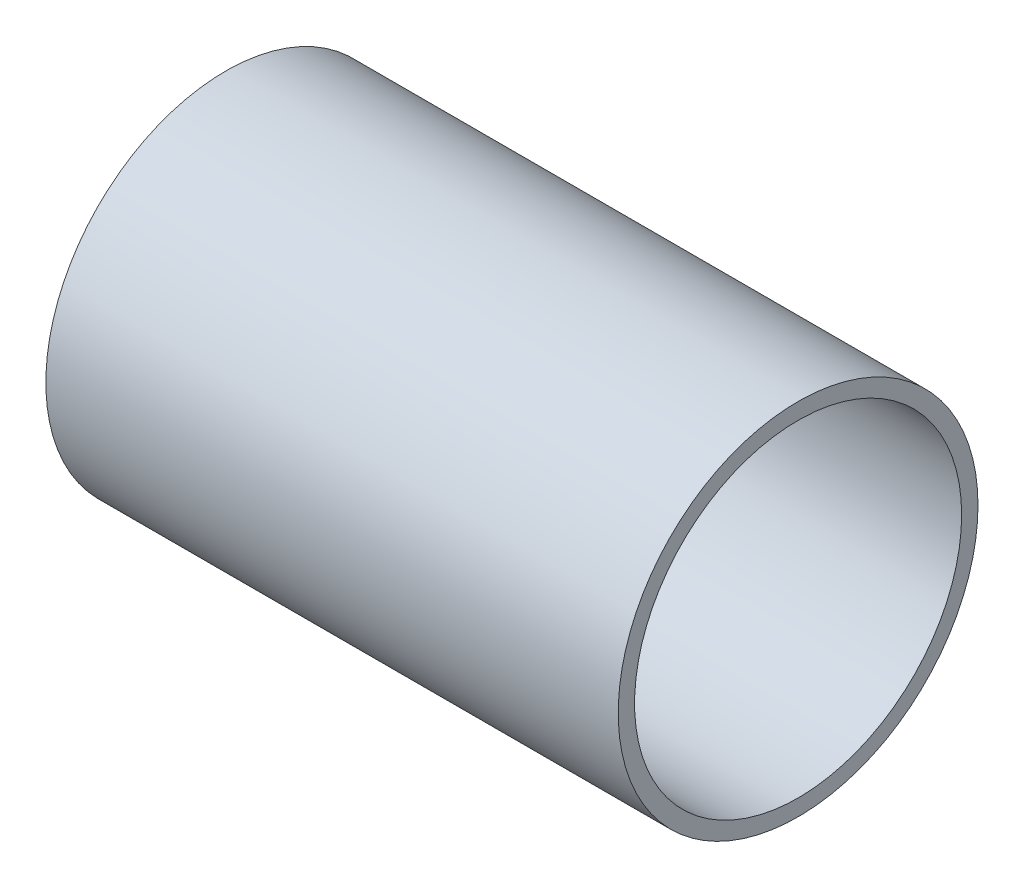
ISO-10303-21;
HEADER;
FILE_DESCRIPTION(('STEP AP214'),'2;1');
FILE_NAME('part.step','',(''),(''),'','','');
FILE_SCHEMA(('AUTOMOTIVE_DESIGN { 1 0 10303 214 1 1 1 1 }'));
ENDSEC;
DATA;
#1=APPLICATION_CONTEXT('core data for automotive mechanical design processes');
#2=APPLICATION_PROTOCOL_DEFINITION('international standard','automotive_design',2000,#1);
#3=PRODUCT_CONTEXT('',#1,'mechanical');
#4=PRODUCT('Part','Part','',(#3));
#5=PRODUCT_RELATED_PRODUCT_CATEGORY('part','',(#4));
#6=PRODUCT_DEFINITION_FORMATION('','',#4);
#7=PRODUCT_DEFINITION_CONTEXT('part definition',#1,'design');
#8=PRODUCT_DEFINITION('design','',#6,#7);
#9=PRODUCT_DEFINITION_SHAPE('','',#8);
#10=(LENGTH_UNIT() NAMED_UNIT(*) SI_UNIT(.MILLI.,.METRE.));
#11=(NAMED_UNIT(*) PLANE_ANGLE_UNIT() SI_UNIT($,.RADIAN.));
#12=(NAMED_UNIT(*) SI_UNIT($,.STERADIAN.) SOLID_ANGLE_UNIT());
#13=UNCERTAINTY_MEASURE_WITH_UNIT(LENGTH_MEASURE(1.E-05),#10,'distance_accuracy_value','');
#14=(GEOMETRIC_REPRESENTATION_CONTEXT(3) GLOBAL_UNCERTAINTY_ASSIGNED_CONTEXT((#13)) GLOBAL_UNIT_ASSIGNED_CONTEXT((#10,
#11,#12)) REPRESENTATION_CONTEXT('',''));
#15=CARTESIAN_POINT('',(0.,0.,0.));
#16=DIRECTION('',(0.,0.,1.));
#17=DIRECTION('',(1.,0.,0.));
#18=AXIS2_PLACEMENT_3D('',#15,#16,#17);
#19=CARTESIAN_POINT('',(70.,0.,0.));
#20=DIRECTION('',(1.,0.,0.));
#21=DIRECTION('',(0.,0.,-1.));
#22=AXIS2_PLACEMENT_3D('',#19,#20,#21);
#23=PLANE('',#22);
#24=CARTESIAN_POINT('',(70.,0.,0.));
#25=DIRECTION('',(1.,0.,0.));
#26=DIRECTION('',(0.,0.,-1.));
#27=AXIS2_PLACEMENT_3D('',#24,#25,#26);
#28=CIRCLE('',#27,22.);
#29=CARTESIAN_POINT('',(70.,0.,-22.));
#30=VERTEX_POINT('',#29);
#31=EDGE_CURVE('E10',#30,#30,#28,.T.);
#32=ORIENTED_EDGE('',*,*,#31,.T.);
#33=EDGE_LOOP('',(#32));
#34=FACE_BOUND('',#33,.T.);
#35=CARTESIAN_POINT('',(70.,0.,0.));
#36=DIRECTION('',(1.,0.,0.));
#37=DIRECTION('',(0.,0.,-1.));
#38=AXIS2_PLACEMENT_3D('',#35,#36,#37);
#39=CIRCLE('',#38,20.);
#40=CARTESIAN_POINT('',(70.,0.,-20.));
#41=VERTEX_POINT('',#40);
#42=EDGE_CURVE('E46',#41,#41,#39,.T.);
#43=ORIENTED_EDGE('',*,*,#42,.F.);
#44=EDGE_LOOP('',(#43));
#45=FACE_BOUND('',#44,.T.);
#46=ADVANCED_FACE('F35',(#34,#45),#23,.T.);
#47=CARTESIAN_POINT('',(0.,0.,0.));
#48=DIRECTION('',(1.,0.,0.));
#49=DIRECTION('',(0.,0.,-1.));
#50=AXIS2_PLACEMENT_3D('',#47,#48,#49);
#51=PLANE('',#50);
#52=CARTESIAN_POINT('',(0.,0.,0.));
#53=DIRECTION('',(1.,0.,0.));
#54=DIRECTION('',(0.,0.,-1.));
#55=AXIS2_PLACEMENT_3D('',#52,#53,#54);
#56=CIRCLE('',#55,22.);
#57=CARTESIAN_POINT('',(0.,0.,-22.));
#58=VERTEX_POINT('',#57);
#59=EDGE_CURVE('E39',#58,#58,#56,.T.);
#60=ORIENTED_EDGE('',*,*,#59,.F.);
#61=EDGE_LOOP('',(#60));
#62=FACE_BOUND('',#61,.T.);
#63=CARTESIAN_POINT('',(0.,0.,0.));
#64=DIRECTION('',(1.,0.,0.));
#65=DIRECTION('',(0.,0.,-1.));
#66=AXIS2_PLACEMENT_3D('',#63,#64,#65);
#67=CIRCLE('',#66,20.);
#68=CARTESIAN_POINT('',(0.,0.,-20.));
#69=VERTEX_POINT('',#68);
#70=EDGE_CURVE('E48',#69,#69,#67,.T.);
#71=ORIENTED_EDGE('',*,*,#70,.T.);
#72=EDGE_LOOP('',(#71));
#73=FACE_BOUND('',#72,.T.);
#74=ADVANCED_FACE('F58',(#62,#73),#51,.F.);
#75=CARTESIAN_POINT('',(70.,0.,0.));
#76=DIRECTION('',(-1.,0.,0.));
#77=DIRECTION('',(0.,0.,1.));
#78=AXIS2_PLACEMENT_3D('',#75,#76,#77);
#79=CYLINDRICAL_SURFACE('',#78,22.);
#80=ORIENTED_EDGE('',*,*,#31,.F.);
#81=EDGE_LOOP('',(#80));
#82=FACE_BOUND('',#81,.T.);
#83=ORIENTED_EDGE('',*,*,#59,.T.);
#84=EDGE_LOOP('',(#83));
#85=FACE_BOUND('',#84,.T.);
#86=ADVANCED_FACE('F37',(#82,#85),#79,.T.);
#87=CARTESIAN_POINT('',(70.,0.,0.));
#88=DIRECTION('',(-1.,0.,0.));
#89=DIRECTION('',(0.,0.,1.));
#90=AXIS2_PLACEMENT_3D('',#87,#88,#89);
#91=CYLINDRICAL_SURFACE('',#90,20.);
#92=ORIENTED_EDGE('',*,*,#42,.T.);
#93=EDGE_LOOP('',(#92));
#94=FACE_BOUND('',#93,.T.);
#95=ORIENTED_EDGE('',*,*,#70,.F.);
#96=EDGE_LOOP('',(#95));
#97=FACE_BOUND('',#96,.T.);
#98=ADVANCED_FACE('F54',(#94,#97),#91,.F.);
#99=CLOSED_SHELL('',(#46,#74,#86,#98));
#100=MANIFOLD_SOLID_BREP('B2',#99);
#101=ADVANCED_BREP_SHAPE_REPRESENTATION('',(#18,#100),#14);
#102=SHAPE_DEFINITION_REPRESENTATION(#9,#101);
ENDSEC;
END-ISO-10303-21;
